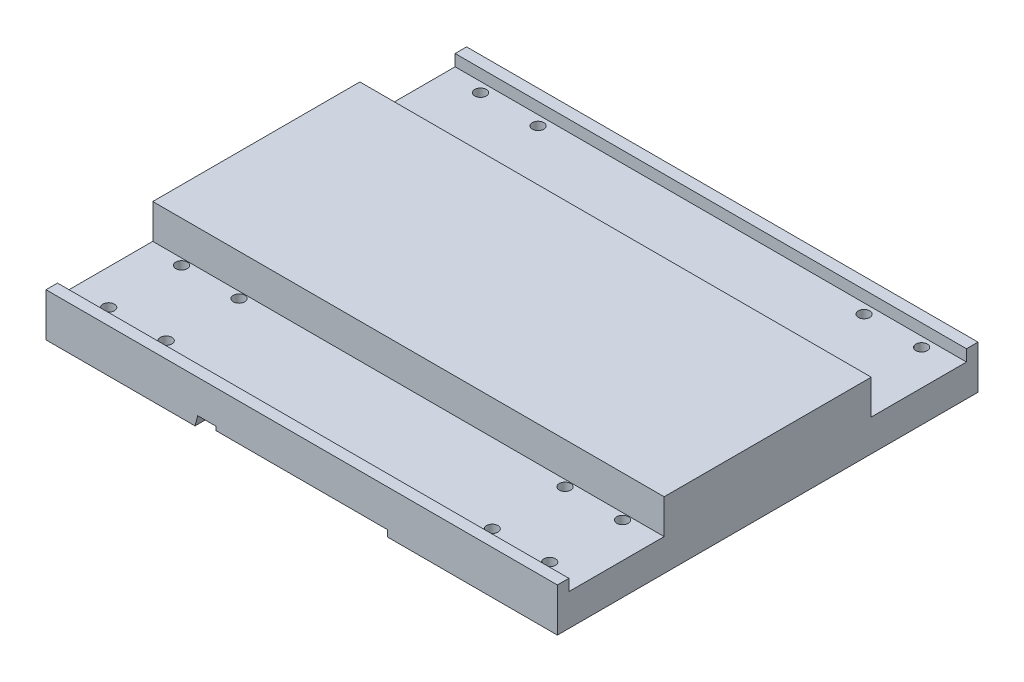
ISO-10303-21;
HEADER;
FILE_DESCRIPTION(('STEP AP214'),'2;1');
FILE_NAME('part.step','',(''),(''),'','','');
FILE_SCHEMA(('AUTOMOTIVE_DESIGN { 1 0 10303 214 1 1 1 1 }'));
ENDSEC;
DATA;
#1=APPLICATION_CONTEXT('core data for automotive mechanical design processes');
#2=APPLICATION_PROTOCOL_DEFINITION('international standard','automotive_design',2000,#1);
#3=PRODUCT_CONTEXT('',#1,'mechanical');
#4=PRODUCT('Part','Part','',(#3));
#5=PRODUCT_RELATED_PRODUCT_CATEGORY('part','',(#4));
#6=PRODUCT_DEFINITION_FORMATION('','',#4);
#7=PRODUCT_DEFINITION_CONTEXT('part definition',#1,'design');
#8=PRODUCT_DEFINITION('design','',#6,#7);
#9=PRODUCT_DEFINITION_SHAPE('','',#8);
#10=(LENGTH_UNIT() NAMED_UNIT(*) SI_UNIT(.MILLI.,.METRE.));
#11=(NAMED_UNIT(*) PLANE_ANGLE_UNIT() SI_UNIT($,.RADIAN.));
#12=(NAMED_UNIT(*) SI_UNIT($,.STERADIAN.) SOLID_ANGLE_UNIT());
#13=UNCERTAINTY_MEASURE_WITH_UNIT(LENGTH_MEASURE(1.E-05),#10,'distance_accuracy_value','');
#14=(GEOMETRIC_REPRESENTATION_CONTEXT(3) GLOBAL_UNCERTAINTY_ASSIGNED_CONTEXT((#13)) GLOBAL_UNIT_ASSIGNED_CONTEXT((#10,
#11,#12)) REPRESENTATION_CONTEXT('',''));
#15=CARTESIAN_POINT('',(0.,0.,0.));
#16=DIRECTION('',(0.,0.,1.));
#17=DIRECTION('',(1.,0.,0.));
#18=AXIS2_PLACEMENT_3D('',#15,#16,#17);
#19=CARTESIAN_POINT('',(0.,25.,0.));
#20=DIRECTION('',(0.,-1.,0.));
#21=DIRECTION('',(0.,0.,-1.));
#22=AXIS2_PLACEMENT_3D('',#19,#20,#21);
#23=PLANE('',#22);
#24=CARTESIAN_POINT('',(327.5,25.,-312.4));
#25=DIRECTION('',(0.,-1.,0.));
#26=DIRECTION('',(0.,0.,-1.));
#27=AXIS2_PLACEMENT_3D('',#24,#25,#26);
#28=CIRCLE('',#27,4.50000000000002);
#29=CARTESIAN_POINT('',(327.5,25.,-316.9));
#30=VERTEX_POINT('',#29);
#31=EDGE_CURVE('E354',#30,#30,#28,.T.);
#32=ORIENTED_EDGE('',*,*,#31,.T.);
#33=EDGE_LOOP('',(#32));
#34=FACE_BOUND('',#33,.T.);
#35=CARTESIAN_POINT('',(372.5,25.,-255.4));
#36=DIRECTION('',(0.,-1.,0.));
#37=DIRECTION('',(0.,0.,-1.));
#38=AXIS2_PLACEMENT_3D('',#35,#36,#37);
#39=CIRCLE('',#38,4.50000000000002);
#40=CARTESIAN_POINT('',(372.5,25.,-259.9));
#41=VERTEX_POINT('',#40);
#42=EDGE_CURVE('E352',#41,#41,#39,.T.);
#43=ORIENTED_EDGE('',*,*,#42,.T.);
#44=EDGE_LOOP('',(#43));
#45=FACE_BOUND('',#44,.T.);
#46=CARTESIAN_POINT('',(327.5,25.,-255.4));
#47=DIRECTION('',(0.,-1.,0.));
#48=DIRECTION('',(0.,0.,-1.));
#49=AXIS2_PLACEMENT_3D('',#46,#47,#48);
#50=CIRCLE('',#49,4.50000000000002);
#51=CARTESIAN_POINT('',(327.5,25.,-259.9));
#52=VERTEX_POINT('',#51);
#53=EDGE_CURVE('E349',#52,#52,#50,.T.);
#54=ORIENTED_EDGE('',*,*,#53,.T.);
#55=EDGE_LOOP('',(#54));
#56=FACE_BOUND('',#55,.T.);
#57=CARTESIAN_POINT('',(372.5,25.,-312.4));
#58=DIRECTION('',(0.,-1.,0.));
#59=DIRECTION('',(0.,0.,-1.));
#60=AXIS2_PLACEMENT_3D('',#57,#58,#59);
#61=CIRCLE('',#60,4.50000000000002);
#62=CARTESIAN_POINT('',(372.5,25.,-316.9));
#63=VERTEX_POINT('',#62);
#64=EDGE_CURVE('E337',#63,#63,#61,.T.);
#65=ORIENTED_EDGE('',*,*,#64,.T.);
#66=EDGE_LOOP('',(#65));
#67=FACE_BOUND('',#66,.T.);
#68=DIRECTION('',(0.,0.,1.));
#69=VECTOR('',#68,1.);
#70=CARTESIAN_POINT('',(0.,25.,0.));
#71=LINE('',#70,#69);
#72=CARTESIAN_POINT('',(0.,25.,-320.));
#73=VERTEX_POINT('',#72);
#74=CARTESIAN_POINT('',(0.,25.,-245.5));
#75=VERTEX_POINT('',#74);
#76=EDGE_CURVE('E69',#73,#75,#71,.T.);
#77=ORIENTED_EDGE('',*,*,#76,.T.);
#78=DIRECTION('',(1.,0.,0.));
#79=VECTOR('',#78,1.);
#80=CARTESIAN_POINT('',(-1.66533453693773E-13,25.,-245.5));
#81=LINE('',#80,#79);
#82=CARTESIAN_POINT('',(400.,25.,-245.5));
#83=VERTEX_POINT('',#82);
#84=EDGE_CURVE('E242',#75,#83,#81,.T.);
#85=ORIENTED_EDGE('',*,*,#84,.T.);
#86=DIRECTION('',(0.,0.,-1.));
#87=VECTOR('',#86,1.);
#88=CARTESIAN_POINT('',(400.,25.,0.));
#89=LINE('',#88,#87);
#90=CARTESIAN_POINT('',(400.,25.,-320.));
#91=VERTEX_POINT('',#90);
#92=EDGE_CURVE('E288',#83,#91,#89,.T.);
#93=ORIENTED_EDGE('',*,*,#92,.T.);
#94=DIRECTION('',(1.,0.,0.));
#95=VECTOR('',#94,1.);
#96=CARTESIAN_POINT('',(0.,25.,-320.));
#97=LINE('',#96,#95);
#98=EDGE_CURVE('E258',#73,#91,#97,.T.);
#99=ORIENTED_EDGE('',*,*,#98,.F.);
#100=EDGE_LOOP('',(#77,#85,#93,#99));
#101=FACE_BOUND('',#100,.T.);
#102=CARTESIAN_POINT('',(27.5,25.,-255.4));
#103=DIRECTION('',(0.,-1.,0.));
#104=DIRECTION('',(0.,0.,-1.));
#105=AXIS2_PLACEMENT_3D('',#102,#103,#104);
#106=CIRCLE('',#105,4.50000000000002);
#107=CARTESIAN_POINT('',(27.5,25.,-259.9));
#108=VERTEX_POINT('',#107);
#109=EDGE_CURVE('E340',#108,#108,#106,.F.);
#110=ORIENTED_EDGE('',*,*,#109,.F.);
#111=EDGE_LOOP('',(#110));
#112=FACE_BOUND('',#111,.T.);
#113=CARTESIAN_POINT('',(72.5,25.,-255.4));
#114=DIRECTION('',(0.,-1.,0.));
#115=DIRECTION('',(0.,0.,-1.));
#116=AXIS2_PLACEMENT_3D('',#113,#114,#115);
#117=CIRCLE('',#116,4.50000000000002);
#118=CARTESIAN_POINT('',(72.5,25.,-259.9));
#119=VERTEX_POINT('',#118);
#120=EDGE_CURVE('E343',#119,#119,#117,.F.);
#121=ORIENTED_EDGE('',*,*,#120,.F.);
#122=EDGE_LOOP('',(#121));
#123=FACE_BOUND('',#122,.T.);
#124=CARTESIAN_POINT('',(72.5,25.,-312.4));
#125=DIRECTION('',(0.,-1.,0.));
#126=DIRECTION('',(0.,0.,-1.));
#127=AXIS2_PLACEMENT_3D('',#124,#125,#126);
#128=CIRCLE('',#127,4.50000000000002);
#129=CARTESIAN_POINT('',(72.5,25.,-316.9));
#130=VERTEX_POINT('',#129);
#131=EDGE_CURVE('E346',#130,#130,#128,.F.);
#132=ORIENTED_EDGE('',*,*,#131,.F.);
#133=EDGE_LOOP('',(#132));
#134=FACE_BOUND('',#133,.T.);
#135=CARTESIAN_POINT('',(27.5,25.,-312.4));
#136=DIRECTION('',(0.,-1.,0.));
#137=DIRECTION('',(0.,0.,-1.));
#138=AXIS2_PLACEMENT_3D('',#135,#136,#137);
#139=CIRCLE('',#138,4.50000000000002);
#140=CARTESIAN_POINT('',(27.5,25.,-316.9));
#141=VERTEX_POINT('',#140);
#142=EDGE_CURVE('E48',#141,#141,#139,.F.);
#143=ORIENTED_EDGE('',*,*,#142,.F.);
#144=EDGE_LOOP('',(#143));
#145=FACE_BOUND('',#144,.T.);
#146=ADVANCED_FACE('F44',(#34,#45,#56,#67,#101,#112,#123,#134,#145),#23,.F.);
#147=CARTESIAN_POINT('',(327.5,25.,-21.5));
#148=DIRECTION('',(0.,-1.,0.));
#149=DIRECTION('',(0.,0.,-1.));
#150=AXIS2_PLACEMENT_3D('',#147,#148,#149);
#151=CIRCLE('',#150,4.50000000000002);
#152=CARTESIAN_POINT('',(327.5,25.,-26.));
#153=VERTEX_POINT('',#152);
#154=EDGE_CURVE('E331',#153,#153,#151,.T.);
#155=ORIENTED_EDGE('',*,*,#154,.T.);
#156=EDGE_LOOP('',(#155));
#157=FACE_BOUND('',#156,.T.);
#158=CARTESIAN_POINT('',(327.5,25.,-78.5));
#159=DIRECTION('',(0.,-1.,0.));
#160=DIRECTION('',(0.,0.,-1.));
#161=AXIS2_PLACEMENT_3D('',#158,#159,#160);
#162=CIRCLE('',#161,4.50000000000002);
#163=CARTESIAN_POINT('',(327.5,25.,-83.));
#164=VERTEX_POINT('',#163);
#165=EDGE_CURVE('E325',#164,#164,#162,.T.);
#166=ORIENTED_EDGE('',*,*,#165,.T.);
#167=EDGE_LOOP('',(#166));
#168=FACE_BOUND('',#167,.T.);
#169=CARTESIAN_POINT('',(72.5,25.,-21.5));
#170=DIRECTION('',(0.,-1.,0.));
#171=DIRECTION('',(0.,0.,-1.));
#172=AXIS2_PLACEMENT_3D('',#169,#170,#171);
#173=CIRCLE('',#172,4.50000000000002);
#174=CARTESIAN_POINT('',(72.5,25.,-26.));
#175=VERTEX_POINT('',#174);
#176=EDGE_CURVE('E322',#175,#175,#173,.F.);
#177=ORIENTED_EDGE('',*,*,#176,.F.);
#178=EDGE_LOOP('',(#177));
#179=FACE_BOUND('',#178,.T.);
#180=CARTESIAN_POINT('',(27.5,25.,-21.5));
#181=DIRECTION('',(0.,-1.,0.));
#182=DIRECTION('',(0.,0.,-1.));
#183=AXIS2_PLACEMENT_3D('',#180,#181,#182);
#184=CIRCLE('',#183,4.50000000000002);
#185=CARTESIAN_POINT('',(27.5,25.,-26.));
#186=VERTEX_POINT('',#185);
#187=EDGE_CURVE('E319',#186,#186,#184,.F.);
#188=ORIENTED_EDGE('',*,*,#187,.F.);
#189=EDGE_LOOP('',(#188));
#190=FACE_BOUND('',#189,.T.);
#191=CARTESIAN_POINT('',(27.5,25.,-78.5));
#192=DIRECTION('',(0.,-1.,0.));
#193=DIRECTION('',(0.,0.,-1.));
#194=AXIS2_PLACEMENT_3D('',#191,#192,#193);
#195=CIRCLE('',#194,4.50000000000002);
#196=CARTESIAN_POINT('',(27.5,25.,-83.));
#197=VERTEX_POINT('',#196);
#198=EDGE_CURVE('E315',#197,#197,#195,.F.);
#199=ORIENTED_EDGE('',*,*,#198,.F.);
#200=EDGE_LOOP('',(#199));
#201=FACE_BOUND('',#200,.T.);
#202=CARTESIAN_POINT('',(72.5,25.,-78.5));
#203=DIRECTION('',(0.,-1.,0.));
#204=DIRECTION('',(0.,0.,-1.));
#205=AXIS2_PLACEMENT_3D('',#202,#203,#204);
#206=CIRCLE('',#205,4.50000000000002);
#207=CARTESIAN_POINT('',(72.5,25.,-83.));
#208=VERTEX_POINT('',#207);
#209=EDGE_CURVE('E312',#208,#208,#206,.F.);
#210=ORIENTED_EDGE('',*,*,#209,.F.);
#211=EDGE_LOOP('',(#210));
#212=FACE_BOUND('',#211,.T.);
#213=CARTESIAN_POINT('',(400.,25.,-9.));
#214=VERTEX_POINT('',#213);
#215=CARTESIAN_POINT('',(400.,25.,-83.5));
#216=VERTEX_POINT('',#215);
#217=EDGE_CURVE('E290',#214,#216,#89,.T.);
#218=ORIENTED_EDGE('',*,*,#217,.T.);
#219=DIRECTION('',(1.,0.,0.));
#220=VECTOR('',#219,1.);
#221=CARTESIAN_POINT('',(-1.66533453693773E-13,25.,-83.5));
#222=LINE('',#221,#220);
#223=CARTESIAN_POINT('',(0.,25.,-83.5));
#224=VERTEX_POINT('',#223);
#225=EDGE_CURVE('E61',#224,#216,#222,.T.);
#226=ORIENTED_EDGE('',*,*,#225,.F.);
#227=CARTESIAN_POINT('',(0.,25.,-9.));
#228=VERTEX_POINT('',#227);
#229=EDGE_CURVE('E289',#224,#228,#71,.T.);
#230=ORIENTED_EDGE('',*,*,#229,.T.);
#231=DIRECTION('',(-1.,0.,0.));
#232=VECTOR('',#231,1.);
#233=CARTESIAN_POINT('',(0.,25.,-9.));
#234=LINE('',#233,#232);
#235=EDGE_CURVE('E255',#214,#228,#234,.T.);
#236=ORIENTED_EDGE('',*,*,#235,.F.);
#237=EDGE_LOOP('',(#218,#226,#230,#236));
#238=FACE_BOUND('',#237,.T.);
#239=CARTESIAN_POINT('',(372.5,25.,-21.5));
#240=DIRECTION('',(0.,-1.,0.));
#241=DIRECTION('',(0.,0.,-1.));
#242=AXIS2_PLACEMENT_3D('',#239,#240,#241);
#243=CIRCLE('',#242,4.50000000000002);
#244=CARTESIAN_POINT('',(372.5,25.,-26.));
#245=VERTEX_POINT('',#244);
#246=EDGE_CURVE('E328',#245,#245,#243,.T.);
#247=ORIENTED_EDGE('',*,*,#246,.T.);
#248=EDGE_LOOP('',(#247));
#249=FACE_BOUND('',#248,.T.);
#250=CARTESIAN_POINT('',(372.5,25.,-78.5));
#251=DIRECTION('',(0.,-1.,0.));
#252=DIRECTION('',(0.,0.,-1.));
#253=AXIS2_PLACEMENT_3D('',#250,#251,#252);
#254=CIRCLE('',#253,4.50000000000002);
#255=CARTESIAN_POINT('',(372.5,25.,-83.));
#256=VERTEX_POINT('',#255);
#257=EDGE_CURVE('E334',#256,#256,#254,.T.);
#258=ORIENTED_EDGE('',*,*,#257,.T.);
#259=EDGE_LOOP('',(#258));
#260=FACE_BOUND('',#259,.T.);
#261=ADVANCED_FACE('F364',(#157,#168,#179,#190,#201,#212,#238,#249,#260),#23,.F.);
#262=CARTESIAN_POINT('',(0.,0.,0.));
#263=DIRECTION('',(0.,-1.,0.));
#264=DIRECTION('',(0.,0.,-1.));
#265=AXIS2_PLACEMENT_3D('',#262,#263,#264);
#266=PLANE('',#265);
#267=CARTESIAN_POINT('',(27.5,0.,-312.4));
#268=DIRECTION('',(0.,1.,0.));
#269=DIRECTION('',(0.,0.,1.));
#270=AXIS2_PLACEMENT_3D('',#267,#268,#269);
#271=CIRCLE('',#270,4.50000000000002);
#272=CARTESIAN_POINT('',(27.5,0.,-307.9));
#273=VERTEX_POINT('',#272);
#274=EDGE_CURVE('E397',#273,#273,#271,.T.);
#275=ORIENTED_EDGE('',*,*,#274,.T.);
#276=EDGE_LOOP('',(#275));
#277=FACE_BOUND('',#276,.T.);
#278=CARTESIAN_POINT('',(72.5,0.,-21.5));
#279=DIRECTION('',(0.,1.,0.));
#280=DIRECTION('',(0.,0.,1.));
#281=AXIS2_PLACEMENT_3D('',#278,#279,#280);
#282=CIRCLE('',#281,4.50000000000002);
#283=CARTESIAN_POINT('',(72.5,0.,-17.));
#284=VERTEX_POINT('',#283);
#285=EDGE_CURVE('E401',#284,#284,#282,.T.);
#286=ORIENTED_EDGE('',*,*,#285,.T.);
#287=EDGE_LOOP('',(#286));
#288=FACE_BOUND('',#287,.T.);
#289=CARTESIAN_POINT('',(27.5,0.,-21.5));
#290=DIRECTION('',(0.,1.,0.));
#291=DIRECTION('',(0.,0.,1.));
#292=AXIS2_PLACEMENT_3D('',#289,#290,#291);
#293=CIRCLE('',#292,4.50000000000002);
#294=CARTESIAN_POINT('',(27.5,0.,-17.));
#295=VERTEX_POINT('',#294);
#296=EDGE_CURVE('E405',#295,#295,#293,.T.);
#297=ORIENTED_EDGE('',*,*,#296,.T.);
#298=EDGE_LOOP('',(#297));
#299=FACE_BOUND('',#298,.T.);
#300=CARTESIAN_POINT('',(27.5,0.,-78.5));
#301=DIRECTION('',(0.,1.,0.));
#302=DIRECTION('',(0.,0.,1.));
#303=AXIS2_PLACEMENT_3D('',#300,#301,#302);
#304=CIRCLE('',#303,4.50000000000002);
#305=CARTESIAN_POINT('',(27.5,0.,-74.));
#306=VERTEX_POINT('',#305);
#307=EDGE_CURVE('E409',#306,#306,#304,.T.);
#308=ORIENTED_EDGE('',*,*,#307,.T.);
#309=EDGE_LOOP('',(#308));
#310=FACE_BOUND('',#309,.T.);
#311=CARTESIAN_POINT('',(72.5,0.,-312.4));
#312=DIRECTION('',(0.,1.,0.));
#313=DIRECTION('',(0.,0.,1.));
#314=AXIS2_PLACEMENT_3D('',#311,#312,#313);
#315=CIRCLE('',#314,4.50000000000002);
#316=CARTESIAN_POINT('',(72.5,0.,-307.9));
#317=VERTEX_POINT('',#316);
#318=EDGE_CURVE('E413',#317,#317,#315,.T.);
#319=ORIENTED_EDGE('',*,*,#318,.T.);
#320=EDGE_LOOP('',(#319));
#321=FACE_BOUND('',#320,.T.);
#322=CARTESIAN_POINT('',(72.5,0.,-255.4));
#323=DIRECTION('',(0.,1.,0.));
#324=DIRECTION('',(0.,0.,1.));
#325=AXIS2_PLACEMENT_3D('',#322,#323,#324);
#326=CIRCLE('',#325,4.50000000000002);
#327=CARTESIAN_POINT('',(72.5,0.,-250.9));
#328=VERTEX_POINT('',#327);
#329=EDGE_CURVE('E417',#328,#328,#326,.T.);
#330=ORIENTED_EDGE('',*,*,#329,.T.);
#331=EDGE_LOOP('',(#330));
#332=FACE_BOUND('',#331,.T.);
#333=CARTESIAN_POINT('',(27.5,0.,-255.4));
#334=DIRECTION('',(0.,1.,0.));
#335=DIRECTION('',(0.,0.,1.));
#336=AXIS2_PLACEMENT_3D('',#333,#334,#335);
#337=CIRCLE('',#336,4.50000000000002);
#338=CARTESIAN_POINT('',(27.5,0.,-250.9));
#339=VERTEX_POINT('',#338);
#340=EDGE_CURVE('E421',#339,#339,#337,.T.);
#341=ORIENTED_EDGE('',*,*,#340,.T.);
#342=EDGE_LOOP('',(#341));
#343=FACE_BOUND('',#342,.T.);
#344=CARTESIAN_POINT('',(72.5,0.,-78.5));
#345=DIRECTION('',(0.,1.,0.));
#346=DIRECTION('',(0.,0.,1.));
#347=AXIS2_PLACEMENT_3D('',#344,#345,#346);
#348=CIRCLE('',#347,4.50000000000002);
#349=CARTESIAN_POINT('',(72.5,0.,-74.));
#350=VERTEX_POINT('',#349);
#351=EDGE_CURVE('E425',#350,#350,#348,.T.);
#352=ORIENTED_EDGE('',*,*,#351,.T.);
#353=EDGE_LOOP('',(#352));
#354=FACE_BOUND('',#353,.T.);
#355=DIRECTION('',(0.,0.,1.));
#356=VECTOR('',#355,1.);
#357=CARTESIAN_POINT('',(116.556406460551,0.,-400.));
#358=LINE('',#357,#356);
#359=CARTESIAN_POINT('',(116.556406460551,0.,-329.));
#360=VERTEX_POINT('',#359);
#361=CARTESIAN_POINT('',(116.556406460551,0.,0.));
#362=VERTEX_POINT('',#361);
#363=EDGE_CURVE('E191',#360,#362,#358,.T.);
#364=ORIENTED_EDGE('',*,*,#363,.T.);
#365=DIRECTION('',(1.,0.,0.));
#366=VECTOR('',#365,1.);
#367=CARTESIAN_POINT('',(0.,0.,0.));
#368=LINE('',#367,#366);
#369=CARTESIAN_POINT('',(0.,0.,0.));
#370=VERTEX_POINT('',#369);
#371=EDGE_CURVE('E190',#370,#362,#368,.T.);
#372=ORIENTED_EDGE('',*,*,#371,.F.);
#373=DIRECTION('',(0.,0.,1.));
#374=VECTOR('',#373,1.);
#375=CARTESIAN_POINT('',(0.,0.,0.));
#376=LINE('',#375,#374);
#377=CARTESIAN_POINT('',(0.,0.,-329.));
#378=VERTEX_POINT('',#377);
#379=EDGE_CURVE('E286',#378,#370,#376,.T.);
#380=ORIENTED_EDGE('',*,*,#379,.F.);
#381=DIRECTION('',(-1.,0.,0.));
#382=VECTOR('',#381,1.);
#383=CARTESIAN_POINT('',(0.,0.,-329.));
#384=LINE('',#383,#382);
#385=EDGE_CURVE('E299',#360,#378,#384,.T.);
#386=ORIENTED_EDGE('',*,*,#385,.F.);
#387=EDGE_LOOP('',(#364,#372,#380,#386));
#388=FACE_BOUND('',#387,.T.);
#389=ADVANCED_FACE('F369',(#277,#288,#299,#310,#321,#332,#343,#354,#388),#266,.T.);
#390=CARTESIAN_POINT('',(0.,25.,0.));
#391=DIRECTION('',(0.,0.,-1.));
#392=DIRECTION('',(-1.,0.,0.));
#393=AXIS2_PLACEMENT_3D('',#390,#391,#392);
#394=PLANE('',#393);
#395=ORIENTED_EDGE('',*,*,#371,.T.);
#396=DIRECTION('',(-0.258819045102524,-0.965925826289068,0.));
#397=VECTOR('',#396,1.);
#398=CARTESIAN_POINT('',(118.7,8.,0.));
#399=LINE('',#398,#397);
#400=CARTESIAN_POINT('',(118.7,8.,0.));
#401=VERTEX_POINT('',#400);
#402=EDGE_CURVE('E173',#401,#362,#399,.T.);
#403=ORIENTED_EDGE('',*,*,#402,.F.);
#404=DIRECTION('',(1.,0.,0.));
#405=VECTOR('',#404,1.);
#406=CARTESIAN_POINT('',(0.,7.99999999999995,0.));
#407=LINE('',#406,#405);
#408=CARTESIAN_POINT('',(133.,8.,0.));
#409=VERTEX_POINT('',#408);
#410=EDGE_CURVE('E188',#401,#409,#407,.T.);
#411=ORIENTED_EDGE('',*,*,#410,.T.);
#412=DIRECTION('',(0.,1.,0.));
#413=VECTOR('',#412,1.);
#414=CARTESIAN_POINT('',(133.,0.,0.));
#415=LINE('',#414,#413);
#416=CARTESIAN_POINT('',(133.,5.,0.));
#417=VERTEX_POINT('',#416);
#418=EDGE_CURVE('E181',#417,#409,#415,.T.);
#419=ORIENTED_EDGE('',*,*,#418,.F.);
#420=DIRECTION('',(-1.,0.,0.));
#421=VECTOR('',#420,1.);
#422=CARTESIAN_POINT('',(0.,5.,0.));
#423=LINE('',#422,#421);
#424=CARTESIAN_POINT('',(267.25,5.,0.));
#425=VERTEX_POINT('',#424);
#426=EDGE_CURVE('E208',#425,#417,#423,.T.);
#427=ORIENTED_EDGE('',*,*,#426,.F.);
#428=DIRECTION('',(0.,-1.,0.));
#429=VECTOR('',#428,1.);
#430=CARTESIAN_POINT('',(267.25,5.,0.));
#431=LINE('',#430,#429);
#432=CARTESIAN_POINT('',(267.25,0.,0.));
#433=VERTEX_POINT('',#432);
#434=EDGE_CURVE('E216',#425,#433,#431,.T.);
#435=ORIENTED_EDGE('',*,*,#434,.T.);
#436=CARTESIAN_POINT('',(400.,0.,0.));
#437=VERTEX_POINT('',#436);
#438=EDGE_CURVE('E295',#433,#437,#368,.T.);
#439=ORIENTED_EDGE('',*,*,#438,.T.);
#440=DIRECTION('',(0.,-1.,0.));
#441=VECTOR('',#440,1.);
#442=CARTESIAN_POINT('',(400.,25.,0.));
#443=LINE('',#442,#441);
#444=CARTESIAN_POINT('',(400.,34.,0.));
#445=VERTEX_POINT('',#444);
#446=EDGE_CURVE('E308',#445,#437,#443,.T.);
#447=ORIENTED_EDGE('',*,*,#446,.F.);
#448=DIRECTION('',(1.,0.,0.));
#449=VECTOR('',#448,1.);
#450=CARTESIAN_POINT('',(400.,34.,0.));
#451=LINE('',#450,#449);
#452=CARTESIAN_POINT('',(0.,34.,0.));
#453=VERTEX_POINT('',#452);
#454=EDGE_CURVE('E259',#453,#445,#451,.T.);
#455=ORIENTED_EDGE('',*,*,#454,.F.);
#456=DIRECTION('',(0.,-1.,0.));
#457=VECTOR('',#456,1.);
#458=CARTESIAN_POINT('',(0.,25.,0.));
#459=LINE('',#458,#457);
#460=EDGE_CURVE('E53',#453,#370,#459,.T.);
#461=ORIENTED_EDGE('',*,*,#460,.T.);
#462=EDGE_LOOP('',(#395,#403,#411,#419,#427,#435,#439,#447,#455,#461));
#463=FACE_BOUND('',#462,.T.);
#464=ADVANCED_FACE('F186',(#463),#394,.F.);
#465=CARTESIAN_POINT('',(0.,25.,-329.));
#466=DIRECTION('',(0.,0.,1.));
#467=DIRECTION('',(1.,0.,0.));
#468=AXIS2_PLACEMENT_3D('',#465,#466,#467);
#469=PLANE('',#468);
#470=DIRECTION('',(1.,0.,0.));
#471=VECTOR('',#470,1.);
#472=CARTESIAN_POINT('',(0.,7.99999999999995,-329.));
#473=LINE('',#472,#471);
#474=CARTESIAN_POINT('',(118.7,8.,-329.));
#475=VERTEX_POINT('',#474);
#476=CARTESIAN_POINT('',(133.,8.,-329.));
#477=VERTEX_POINT('',#476);
#478=EDGE_CURVE('E12',#475,#477,#473,.T.);
#479=ORIENTED_EDGE('',*,*,#478,.F.);
#480=DIRECTION('',(-0.258819045102524,-0.965925826289067,0.));
#481=VECTOR('',#480,1.);
#482=CARTESIAN_POINT('',(114.998607714606,-5.81378406783267,-329.));
#483=LINE('',#482,#481);
#484=EDGE_CURVE('E176',#475,#360,#483,.T.);
#485=ORIENTED_EDGE('',*,*,#484,.T.);
#486=ORIENTED_EDGE('',*,*,#385,.T.);
#487=DIRECTION('',(0.,-1.,0.));
#488=VECTOR('',#487,1.);
#489=CARTESIAN_POINT('',(0.,25.,-329.));
#490=LINE('',#489,#488);
#491=CARTESIAN_POINT('',(0.,34.,-329.));
#492=VERTEX_POINT('',#491);
#493=EDGE_CURVE('E292',#492,#378,#490,.T.);
#494=ORIENTED_EDGE('',*,*,#493,.F.);
#495=DIRECTION('',(-1.,0.,0.));
#496=VECTOR('',#495,1.);
#497=CARTESIAN_POINT('',(400.,34.,-329.));
#498=LINE('',#497,#496);
#499=CARTESIAN_POINT('',(400.,34.,-329.));
#500=VERTEX_POINT('',#499);
#501=EDGE_CURVE('E268',#500,#492,#498,.T.);
#502=ORIENTED_EDGE('',*,*,#501,.F.);
#503=DIRECTION('',(0.,-1.,0.));
#504=VECTOR('',#503,1.);
#505=CARTESIAN_POINT('',(400.,25.,-329.));
#506=LINE('',#505,#504);
#507=CARTESIAN_POINT('',(400.,0.,-329.));
#508=VERTEX_POINT('',#507);
#509=EDGE_CURVE('E305',#500,#508,#506,.T.);
#510=ORIENTED_EDGE('',*,*,#509,.T.);
#511=CARTESIAN_POINT('',(267.25,0.,-329.));
#512=VERTEX_POINT('',#511);
#513=EDGE_CURVE('E300',#508,#512,#384,.T.);
#514=ORIENTED_EDGE('',*,*,#513,.T.);
#515=DIRECTION('',(0.,-1.,0.));
#516=VECTOR('',#515,1.);
#517=CARTESIAN_POINT('',(267.25,5.,-329.));
#518=LINE('',#517,#516);
#519=CARTESIAN_POINT('',(267.25,5.,-329.));
#520=VERTEX_POINT('',#519);
#521=EDGE_CURVE('E219',#520,#512,#518,.T.);
#522=ORIENTED_EDGE('',*,*,#521,.F.);
#523=DIRECTION('',(1.,0.,0.));
#524=VECTOR('',#523,1.);
#525=CARTESIAN_POINT('',(0.,5.,-329.));
#526=LINE('',#525,#524);
#527=CARTESIAN_POINT('',(133.,5.,-329.));
#528=VERTEX_POINT('',#527);
#529=EDGE_CURVE('E213',#528,#520,#526,.T.);
#530=ORIENTED_EDGE('',*,*,#529,.F.);
#531=DIRECTION('',(0.,1.,0.));
#532=VECTOR('',#531,1.);
#533=CARTESIAN_POINT('',(133.,25.,-329.));
#534=LINE('',#533,#532);
#535=EDGE_CURVE('E201',#528,#477,#534,.T.);
#536=ORIENTED_EDGE('',*,*,#535,.T.);
#537=EDGE_LOOP('',(#479,#485,#486,#494,#502,#510,#514,#522,#530,#536));
#538=FACE_BOUND('',#537,.T.);
#539=ADVANCED_FACE('F379',(#538),#469,.F.);
#540=CARTESIAN_POINT('',(372.5,0.,-78.5));
#541=DIRECTION('',(0.,-1.,0.));
#542=DIRECTION('',(0.,0.,-1.));
#543=AXIS2_PLACEMENT_3D('',#540,#541,#542);
#544=CIRCLE('',#543,4.50000000000002);
#545=CARTESIAN_POINT('',(372.5,0.,-83.));
#546=VERTEX_POINT('',#545);
#547=EDGE_CURVE('E441',#546,#546,#544,.T.);
#548=ORIENTED_EDGE('',*,*,#547,.F.);
#549=EDGE_LOOP('',(#548));
#550=FACE_BOUND('',#549,.T.);
#551=CARTESIAN_POINT('',(327.5,0.,-21.5));
#552=DIRECTION('',(0.,-1.,0.));
#553=DIRECTION('',(0.,0.,-1.));
#554=AXIS2_PLACEMENT_3D('',#551,#552,#553);
#555=CIRCLE('',#554,4.50000000000002);
#556=CARTESIAN_POINT('',(327.5,0.,-26.));
#557=VERTEX_POINT('',#556);
#558=EDGE_CURVE('E444',#557,#557,#555,.T.);
#559=ORIENTED_EDGE('',*,*,#558,.F.);
#560=EDGE_LOOP('',(#559));
#561=FACE_BOUND('',#560,.T.);
#562=CARTESIAN_POINT('',(372.5,0.,-21.5));
#563=DIRECTION('',(0.,-1.,0.));
#564=DIRECTION('',(0.,0.,-1.));
#565=AXIS2_PLACEMENT_3D('',#562,#563,#564);
#566=CIRCLE('',#565,4.50000000000002);
#567=CARTESIAN_POINT('',(372.5,0.,-26.));
#568=VERTEX_POINT('',#567);
#569=EDGE_CURVE('E447',#568,#568,#566,.T.);
#570=ORIENTED_EDGE('',*,*,#569,.F.);
#571=EDGE_LOOP('',(#570));
#572=FACE_BOUND('',#571,.T.);
#573=CARTESIAN_POINT('',(327.5,0.,-312.4));
#574=DIRECTION('',(0.,-1.,0.));
#575=DIRECTION('',(0.,0.,-1.));
#576=AXIS2_PLACEMENT_3D('',#573,#574,#575);
#577=CIRCLE('',#576,4.50000000000002);
#578=CARTESIAN_POINT('',(327.5,0.,-316.9));
#579=VERTEX_POINT('',#578);
#580=EDGE_CURVE('E431',#579,#579,#577,.T.);
#581=ORIENTED_EDGE('',*,*,#580,.F.);
#582=EDGE_LOOP('',(#581));
#583=FACE_BOUND('',#582,.T.);
#584=CARTESIAN_POINT('',(372.5,0.,-255.4));
#585=DIRECTION('',(0.,-1.,0.));
#586=DIRECTION('',(0.,0.,-1.));
#587=AXIS2_PLACEMENT_3D('',#584,#585,#586);
#588=CIRCLE('',#587,4.50000000000002);
#589=CARTESIAN_POINT('',(372.5,0.,-259.9));
#590=VERTEX_POINT('',#589);
#591=EDGE_CURVE('E432',#590,#590,#588,.T.);
#592=ORIENTED_EDGE('',*,*,#591,.F.);
#593=EDGE_LOOP('',(#592));
#594=FACE_BOUND('',#593,.T.);
#595=CARTESIAN_POINT('',(327.5,0.,-255.4));
#596=DIRECTION('',(0.,-1.,0.));
#597=DIRECTION('',(0.,0.,-1.));
#598=AXIS2_PLACEMENT_3D('',#595,#596,#597);
#599=CIRCLE('',#598,4.50000000000002);
#600=CARTESIAN_POINT('',(327.5,0.,-259.9));
#601=VERTEX_POINT('',#600);
#602=EDGE_CURVE('E435',#601,#601,#599,.T.);
#603=ORIENTED_EDGE('',*,*,#602,.F.);
#604=EDGE_LOOP('',(#603));
#605=FACE_BOUND('',#604,.T.);
#606=CARTESIAN_POINT('',(327.5,0.,-78.5));
#607=DIRECTION('',(0.,-1.,0.));
#608=DIRECTION('',(0.,0.,-1.));
#609=AXIS2_PLACEMENT_3D('',#606,#607,#608);
#610=CIRCLE('',#609,4.50000000000002);
#611=CARTESIAN_POINT('',(327.5,0.,-83.));
#612=VERTEX_POINT('',#611);
#613=EDGE_CURVE('E438',#612,#612,#610,.T.);
#614=ORIENTED_EDGE('',*,*,#613,.F.);
#615=EDGE_LOOP('',(#614));
#616=FACE_BOUND('',#615,.T.);
#617=CARTESIAN_POINT('',(372.5,0.,-312.4));
#618=DIRECTION('',(0.,-1.,0.));
#619=DIRECTION('',(0.,0.,-1.));
#620=AXIS2_PLACEMENT_3D('',#617,#618,#619);
#621=CIRCLE('',#620,4.50000000000002);
#622=CARTESIAN_POINT('',(372.5,0.,-316.9));
#623=VERTEX_POINT('',#622);
#624=EDGE_CURVE('E316',#623,#623,#621,.T.);
#625=ORIENTED_EDGE('',*,*,#624,.F.);
#626=EDGE_LOOP('',(#625));
#627=FACE_BOUND('',#626,.T.);
#628=ORIENTED_EDGE('',*,*,#438,.F.);
#629=DIRECTION('',(0.,0.,-1.));
#630=VECTOR('',#629,1.);
#631=CARTESIAN_POINT('',(267.25,0.,0.));
#632=LINE('',#631,#630);
#633=EDGE_CURVE('E205',#433,#512,#632,.T.);
#634=ORIENTED_EDGE('',*,*,#633,.T.);
#635=ORIENTED_EDGE('',*,*,#513,.F.);
#636=DIRECTION('',(0.,0.,-1.));
#637=VECTOR('',#636,1.);
#638=CARTESIAN_POINT('',(400.,0.,0.));
#639=LINE('',#638,#637);
#640=EDGE_CURVE('E297',#437,#508,#639,.T.);
#641=ORIENTED_EDGE('',*,*,#640,.F.);
#642=EDGE_LOOP('',(#628,#634,#635,#641));
#643=FACE_BOUND('',#642,.T.);
#644=ADVANCED_FACE('F376',(#550,#561,#572,#583,#594,#605,#616,#627,#643),#266,.T.);
#645=CARTESIAN_POINT('',(0.,25.,0.));
#646=DIRECTION('',(1.,0.,0.));
#647=DIRECTION('',(0.,0.,-1.));
#648=AXIS2_PLACEMENT_3D('',#645,#646,#647);
#649=PLANE('',#648);
#650=ORIENTED_EDGE('',*,*,#379,.T.);
#651=ORIENTED_EDGE('',*,*,#460,.F.);
#652=DIRECTION('',(0.,0.,1.));
#653=VECTOR('',#652,1.);
#654=CARTESIAN_POINT('',(0.,34.,0.));
#655=LINE('',#654,#653);
#656=CARTESIAN_POINT('',(0.,34.,-9.));
#657=VERTEX_POINT('',#656);
#658=EDGE_CURVE('E254',#657,#453,#655,.T.);
#659=ORIENTED_EDGE('',*,*,#658,.F.);
#660=DIRECTION('',(0.,-1.,0.));
#661=VECTOR('',#660,1.);
#662=CARTESIAN_POINT('',(0.,34.,-9.));
#663=LINE('',#662,#661);
#664=EDGE_CURVE('E251',#657,#228,#663,.T.);
#665=ORIENTED_EDGE('',*,*,#664,.T.);
#666=ORIENTED_EDGE('',*,*,#229,.F.);
#667=DIRECTION('',(0.,-1.,0.));
#668=VECTOR('',#667,1.);
#669=CARTESIAN_POINT('',(-1.66533453693773E-13,0.,-83.5));
#670=LINE('',#669,#668);
#671=CARTESIAN_POINT('',(-1.66533453693773E-13,52.,-83.5));
#672=VERTEX_POINT('',#671);
#673=EDGE_CURVE('E231',#672,#224,#670,.T.);
#674=ORIENTED_EDGE('',*,*,#673,.F.);
#675=DIRECTION('',(0.,0.,1.));
#676=VECTOR('',#675,1.);
#677=CARTESIAN_POINT('',(-1.66533453693773E-13,52.,0.));
#678=LINE('',#677,#676);
#679=CARTESIAN_POINT('',(-1.66533453693773E-13,52.,-245.5));
#680=VERTEX_POINT('',#679);
#681=EDGE_CURVE('E227',#680,#672,#678,.T.);
#682=ORIENTED_EDGE('',*,*,#681,.F.);
#683=DIRECTION('',(0.,1.,0.));
#684=VECTOR('',#683,1.);
#685=CARTESIAN_POINT('',(-1.66533453693773E-13,0.,-245.5));
#686=LINE('',#685,#684);
#687=EDGE_CURVE('E224',#75,#680,#686,.T.);
#688=ORIENTED_EDGE('',*,*,#687,.F.);
#689=ORIENTED_EDGE('',*,*,#76,.F.);
#690=DIRECTION('',(0.,-1.,0.));
#691=VECTOR('',#690,1.);
#692=CARTESIAN_POINT('',(0.,34.,-320.));
#693=LINE('',#692,#691);
#694=CARTESIAN_POINT('',(0.,34.,-320.));
#695=VERTEX_POINT('',#694);
#696=EDGE_CURVE('E283',#695,#73,#693,.T.);
#697=ORIENTED_EDGE('',*,*,#696,.F.);
#698=DIRECTION('',(0.,0.,1.));
#699=VECTOR('',#698,1.);
#700=CARTESIAN_POINT('',(0.,34.,-329.));
#701=LINE('',#700,#699);
#702=EDGE_CURVE('E271',#492,#695,#701,.T.);
#703=ORIENTED_EDGE('',*,*,#702,.F.);
#704=ORIENTED_EDGE('',*,*,#493,.T.);
#705=EDGE_LOOP('',(#650,#651,#659,#665,#666,#674,#682,#688,#689,#697,#703,#704));
#706=FACE_BOUND('',#705,.T.);
#707=ADVANCED_FACE('F46',(#706),#649,.F.);
#708=CARTESIAN_POINT('',(400.,25.,0.));
#709=DIRECTION('',(-1.,0.,0.));
#710=DIRECTION('',(0.,0.,1.));
#711=AXIS2_PLACEMENT_3D('',#708,#709,#710);
#712=PLANE('',#711);
#713=ORIENTED_EDGE('',*,*,#640,.T.);
#714=ORIENTED_EDGE('',*,*,#509,.F.);
#715=DIRECTION('',(0.,0.,-1.));
#716=VECTOR('',#715,1.);
#717=CARTESIAN_POINT('',(400.,34.,-320.));
#718=LINE('',#717,#716);
#719=CARTESIAN_POINT('',(400.,34.,-320.));
#720=VERTEX_POINT('',#719);
#721=EDGE_CURVE('E275',#720,#500,#718,.T.);
#722=ORIENTED_EDGE('',*,*,#721,.F.);
#723=DIRECTION('',(0.,-1.,0.));
#724=VECTOR('',#723,1.);
#725=CARTESIAN_POINT('',(400.,34.,-320.));
#726=LINE('',#725,#724);
#727=EDGE_CURVE('E278',#720,#91,#726,.T.);
#728=ORIENTED_EDGE('',*,*,#727,.T.);
#729=ORIENTED_EDGE('',*,*,#92,.F.);
#730=DIRECTION('',(0.,1.,0.));
#731=VECTOR('',#730,1.);
#732=CARTESIAN_POINT('',(400.,0.,-245.5));
#733=LINE('',#732,#731);
#734=CARTESIAN_POINT('',(400.,52.,-245.5));
#735=VERTEX_POINT('',#734);
#736=EDGE_CURVE('E221',#83,#735,#733,.T.);
#737=ORIENTED_EDGE('',*,*,#736,.T.);
#738=DIRECTION('',(0.,0.,1.));
#739=VECTOR('',#738,1.);
#740=CARTESIAN_POINT('',(400.,52.,0.));
#741=LINE('',#740,#739);
#742=CARTESIAN_POINT('',(400.,52.,-83.5));
#743=VERTEX_POINT('',#742);
#744=EDGE_CURVE('E237',#735,#743,#741,.T.);
#745=ORIENTED_EDGE('',*,*,#744,.T.);
#746=DIRECTION('',(0.,-1.,0.));
#747=VECTOR('',#746,1.);
#748=CARTESIAN_POINT('',(400.,0.,-83.5));
#749=LINE('',#748,#747);
#750=EDGE_CURVE('E228',#743,#216,#749,.T.);
#751=ORIENTED_EDGE('',*,*,#750,.T.);
#752=ORIENTED_EDGE('',*,*,#217,.F.);
#753=DIRECTION('',(0.,-1.,0.));
#754=VECTOR('',#753,1.);
#755=CARTESIAN_POINT('',(400.,34.,-9.));
#756=LINE('',#755,#754);
#757=CARTESIAN_POINT('',(400.,34.,-9.));
#758=VERTEX_POINT('',#757);
#759=EDGE_CURVE('E244',#758,#214,#756,.T.);
#760=ORIENTED_EDGE('',*,*,#759,.F.);
#761=DIRECTION('',(0.,0.,-1.));
#762=VECTOR('',#761,1.);
#763=CARTESIAN_POINT('',(400.,34.,-9.));
#764=LINE('',#763,#762);
#765=EDGE_CURVE('E264',#445,#758,#764,.T.);
#766=ORIENTED_EDGE('',*,*,#765,.F.);
#767=ORIENTED_EDGE('',*,*,#446,.T.);
#768=EDGE_LOOP('',(#713,#714,#722,#728,#729,#737,#745,#751,#752,#760,#766,#767));
#769=FACE_BOUND('',#768,.T.);
#770=ADVANCED_FACE('F384',(#769),#712,.F.);
#771=CARTESIAN_POINT('',(0.,34.,-320.));
#772=DIRECTION('',(0.,0.,-1.));
#773=DIRECTION('',(-1.,0.,0.));
#774=AXIS2_PLACEMENT_3D('',#771,#772,#773);
#775=PLANE('',#774);
#776=ORIENTED_EDGE('',*,*,#98,.T.);
#777=ORIENTED_EDGE('',*,*,#727,.F.);
#778=DIRECTION('',(1.,0.,0.));
#779=VECTOR('',#778,1.);
#780=CARTESIAN_POINT('',(0.,34.,-320.));
#781=LINE('',#780,#779);
#782=EDGE_CURVE('E273',#695,#720,#781,.T.);
#783=ORIENTED_EDGE('',*,*,#782,.F.);
#784=ORIENTED_EDGE('',*,*,#696,.T.);
#785=EDGE_LOOP('',(#776,#777,#783,#784));
#786=FACE_BOUND('',#785,.T.);
#787=ADVANCED_FACE('F374',(#786),#775,.F.);
#788=CARTESIAN_POINT('',(0.,34.,0.));
#789=DIRECTION('',(0.,1.,0.));
#790=DIRECTION('',(0.,0.,1.));
#791=AXIS2_PLACEMENT_3D('',#788,#789,#790);
#792=PLANE('',#791);
#793=ORIENTED_EDGE('',*,*,#501,.T.);
#794=ORIENTED_EDGE('',*,*,#702,.T.);
#795=ORIENTED_EDGE('',*,*,#782,.T.);
#796=ORIENTED_EDGE('',*,*,#721,.T.);
#797=EDGE_LOOP('',(#793,#794,#795,#796));
#798=FACE_BOUND('',#797,.T.);
#799=ADVANCED_FACE('F502',(#798),#792,.T.);
#800=CARTESIAN_POINT('',(0.,34.,-9.));
#801=DIRECTION('',(0.,0.,1.));
#802=DIRECTION('',(1.,0.,0.));
#803=AXIS2_PLACEMENT_3D('',#800,#801,#802);
#804=PLANE('',#803);
#805=ORIENTED_EDGE('',*,*,#235,.T.);
#806=ORIENTED_EDGE('',*,*,#664,.F.);
#807=DIRECTION('',(-1.,0.,0.));
#808=VECTOR('',#807,1.);
#809=CARTESIAN_POINT('',(0.,34.,-9.));
#810=LINE('',#809,#808);
#811=EDGE_CURVE('E262',#758,#657,#810,.T.);
#812=ORIENTED_EDGE('',*,*,#811,.F.);
#813=ORIENTED_EDGE('',*,*,#759,.T.);
#814=EDGE_LOOP('',(#805,#806,#812,#813));
#815=FACE_BOUND('',#814,.T.);
#816=ADVANCED_FACE('F523',(#815),#804,.F.);
#817=CARTESIAN_POINT('',(0.,34.,0.));
#818=DIRECTION('',(0.,-1.,0.));
#819=DIRECTION('',(0.,0.,-1.));
#820=AXIS2_PLACEMENT_3D('',#817,#818,#819);
#821=PLANE('',#820);
#822=ORIENTED_EDGE('',*,*,#454,.T.);
#823=ORIENTED_EDGE('',*,*,#765,.T.);
#824=ORIENTED_EDGE('',*,*,#811,.T.);
#825=ORIENTED_EDGE('',*,*,#658,.T.);
#826=EDGE_LOOP('',(#822,#823,#824,#825));
#827=FACE_BOUND('',#826,.T.);
#828=ADVANCED_FACE('F484',(#827),#821,.F.);
#829=CARTESIAN_POINT('',(-1.66533453693773E-13,0.,-245.5));
#830=DIRECTION('',(0.,0.,-1.));
#831=DIRECTION('',(-1.,0.,0.));
#832=AXIS2_PLACEMENT_3D('',#829,#830,#831);
#833=PLANE('',#832);
#834=ORIENTED_EDGE('',*,*,#736,.F.);
#835=ORIENTED_EDGE('',*,*,#84,.F.);
#836=ORIENTED_EDGE('',*,*,#687,.T.);
#837=DIRECTION('',(1.,0.,0.));
#838=VECTOR('',#837,1.);
#839=CARTESIAN_POINT('',(-1.66533453693773E-13,52.,-245.5));
#840=LINE('',#839,#838);
#841=EDGE_CURVE('E234',#680,#735,#840,.T.);
#842=ORIENTED_EDGE('',*,*,#841,.T.);
#843=EDGE_LOOP('',(#834,#835,#836,#842));
#844=FACE_BOUND('',#843,.T.);
#845=ADVANCED_FACE('F510',(#844),#833,.T.);
#846=CARTESIAN_POINT('',(-1.66533453693773E-13,0.,-83.5));
#847=DIRECTION('',(0.,0.,1.));
#848=DIRECTION('',(0.,-1.,0.));
#849=AXIS2_PLACEMENT_3D('',#846,#847,#848);
#850=PLANE('',#849);
#851=ORIENTED_EDGE('',*,*,#750,.F.);
#852=DIRECTION('',(1.,0.,0.));
#853=VECTOR('',#852,1.);
#854=CARTESIAN_POINT('',(-1.66533453693773E-13,52.,-83.5));
#855=LINE('',#854,#853);
#856=EDGE_CURVE('E246',#672,#743,#855,.T.);
#857=ORIENTED_EDGE('',*,*,#856,.F.);
#858=ORIENTED_EDGE('',*,*,#673,.T.);
#859=ORIENTED_EDGE('',*,*,#225,.T.);
#860=EDGE_LOOP('',(#851,#857,#858,#859));
#861=FACE_BOUND('',#860,.T.);
#862=ADVANCED_FACE('F518',(#861),#850,.T.);
#863=CARTESIAN_POINT('',(-1.66533453693773E-13,52.,0.));
#864=DIRECTION('',(0.,1.,0.));
#865=DIRECTION('',(0.,0.,1.));
#866=AXIS2_PLACEMENT_3D('',#863,#864,#865);
#867=PLANE('',#866);
#868=ORIENTED_EDGE('',*,*,#744,.F.);
#869=ORIENTED_EDGE('',*,*,#841,.F.);
#870=ORIENTED_EDGE('',*,*,#681,.T.);
#871=ORIENTED_EDGE('',*,*,#856,.T.);
#872=EDGE_LOOP('',(#868,#869,#870,#871));
#873=FACE_BOUND('',#872,.T.);
#874=ADVANCED_FACE('F514',(#873),#867,.T.);
#875=CARTESIAN_POINT('',(267.25,5.,0.));
#876=DIRECTION('',(-1.,0.,0.));
#877=DIRECTION('',(0.,0.,1.));
#878=AXIS2_PLACEMENT_3D('',#875,#876,#877);
#879=PLANE('',#878);
#880=ORIENTED_EDGE('',*,*,#633,.F.);
#881=ORIENTED_EDGE('',*,*,#434,.F.);
#882=DIRECTION('',(0.,0.,-1.));
#883=VECTOR('',#882,1.);
#884=CARTESIAN_POINT('',(267.25,5.,0.));
#885=LINE('',#884,#883);
#886=EDGE_CURVE('E206',#425,#520,#885,.T.);
#887=ORIENTED_EDGE('',*,*,#886,.T.);
#888=ORIENTED_EDGE('',*,*,#521,.T.);
#889=EDGE_LOOP('',(#880,#881,#887,#888));
#890=FACE_BOUND('',#889,.T.);
#891=ADVANCED_FACE('F499',(#890),#879,.T.);
#892=CARTESIAN_POINT('',(0.,5.,0.));
#893=DIRECTION('',(0.,-1.,0.));
#894=DIRECTION('',(0.,0.,-1.));
#895=AXIS2_PLACEMENT_3D('',#892,#893,#894);
#896=PLANE('',#895);
#897=ORIENTED_EDGE('',*,*,#886,.F.);
#898=ORIENTED_EDGE('',*,*,#426,.T.);
#899=DIRECTION('',(0.,0.,1.));
#900=VECTOR('',#899,1.);
#901=CARTESIAN_POINT('',(133.,5.,0.));
#902=LINE('',#901,#900);
#903=EDGE_CURVE('E211',#528,#417,#902,.T.);
#904=ORIENTED_EDGE('',*,*,#903,.F.);
#905=ORIENTED_EDGE('',*,*,#529,.T.);
#906=EDGE_LOOP('',(#897,#898,#904,#905));
#907=FACE_BOUND('',#906,.T.);
#908=ADVANCED_FACE('F496',(#907),#896,.T.);
#909=CARTESIAN_POINT('',(0.,7.99999999999995,-400.));
#910=DIRECTION('',(0.,-1.,0.));
#911=DIRECTION('',(1.,0.,0.));
#912=AXIS2_PLACEMENT_3D('',#909,#910,#911);
#913=PLANE('',#912);
#914=ORIENTED_EDGE('',*,*,#478,.T.);
#915=DIRECTION('',(0.,0.,1.));
#916=VECTOR('',#915,1.);
#917=CARTESIAN_POINT('',(133.,8.,-400.));
#918=LINE('',#917,#916);
#919=EDGE_CURVE('E180',#477,#409,#918,.T.);
#920=ORIENTED_EDGE('',*,*,#919,.T.);
#921=ORIENTED_EDGE('',*,*,#410,.F.);
#922=DIRECTION('',(0.,0.,1.));
#923=VECTOR('',#922,1.);
#924=CARTESIAN_POINT('',(118.7,8.,-400.));
#925=LINE('',#924,#923);
#926=EDGE_CURVE('E170',#475,#401,#925,.T.);
#927=ORIENTED_EDGE('',*,*,#926,.F.);
#928=EDGE_LOOP('',(#914,#920,#921,#927));
#929=FACE_BOUND('',#928,.T.);
#930=ADVANCED_FACE('F193',(#929),#913,.T.);
#931=CARTESIAN_POINT('',(133.,0.,-400.));
#932=DIRECTION('',(1.,0.,0.));
#933=DIRECTION('',(0.,0.,-1.));
#934=AXIS2_PLACEMENT_3D('',#931,#932,#933);
#935=PLANE('',#934);
#936=ORIENTED_EDGE('',*,*,#903,.T.);
#937=ORIENTED_EDGE('',*,*,#418,.T.);
#938=ORIENTED_EDGE('',*,*,#919,.F.);
#939=ORIENTED_EDGE('',*,*,#535,.F.);
#940=EDGE_LOOP('',(#936,#937,#938,#939));
#941=FACE_BOUND('',#940,.T.);
#942=ADVANCED_FACE('F492',(#941),#935,.F.);
#943=CARTESIAN_POINT('',(118.7,8.,-400.));
#944=DIRECTION('',(-0.965925826289067,0.258819045102524,0.));
#945=DIRECTION('',(-0.258819045102524,-0.965925826289067,0.));
#946=AXIS2_PLACEMENT_3D('',#943,#944,#945);
#947=PLANE('',#946);
#948=ORIENTED_EDGE('',*,*,#926,.T.);
#949=ORIENTED_EDGE('',*,*,#402,.T.);
#950=ORIENTED_EDGE('',*,*,#363,.F.);
#951=ORIENTED_EDGE('',*,*,#484,.F.);
#952=EDGE_LOOP('',(#948,#949,#950,#951));
#953=FACE_BOUND('',#952,.T.);
#954=ADVANCED_FACE('F172',(#953),#947,.F.);
#955=CARTESIAN_POINT('',(72.5,400.,-78.5));
#956=DIRECTION('',(0.,-1.,0.));
#957=DIRECTION('',(0.,0.,-1.));
#958=AXIS2_PLACEMENT_3D('',#955,#956,#957);
#959=CYLINDRICAL_SURFACE('',#958,4.50000000000002);
#960=ORIENTED_EDGE('',*,*,#351,.F.);
#961=EDGE_LOOP('',(#960));
#962=FACE_BOUND('',#961,.T.);
#963=ORIENTED_EDGE('',*,*,#209,.T.);
#964=EDGE_LOOP('',(#963));
#965=FACE_BOUND('',#964,.T.);
#966=ADVANCED_FACE('F548',(#962,#965),#959,.F.);
#967=CARTESIAN_POINT('',(27.5,400.,-78.5));
#968=DIRECTION('',(0.,-1.,0.));
#969=DIRECTION('',(0.,0.,-1.));
#970=AXIS2_PLACEMENT_3D('',#967,#968,#969);
#971=CYLINDRICAL_SURFACE('',#970,4.50000000000002);
#972=ORIENTED_EDGE('',*,*,#307,.F.);
#973=EDGE_LOOP('',(#972));
#974=FACE_BOUND('',#973,.T.);
#975=ORIENTED_EDGE('',*,*,#198,.T.);
#976=EDGE_LOOP('',(#975));
#977=FACE_BOUND('',#976,.T.);
#978=ADVANCED_FACE('F594',(#974,#977),#971,.F.);
#979=CARTESIAN_POINT('',(27.5,400.,-21.5));
#980=DIRECTION('',(0.,-1.,0.));
#981=DIRECTION('',(0.,0.,-1.));
#982=AXIS2_PLACEMENT_3D('',#979,#980,#981);
#983=CYLINDRICAL_SURFACE('',#982,4.50000000000002);
#984=ORIENTED_EDGE('',*,*,#296,.F.);
#985=EDGE_LOOP('',(#984));
#986=FACE_BOUND('',#985,.T.);
#987=ORIENTED_EDGE('',*,*,#187,.T.);
#988=EDGE_LOOP('',(#987));
#989=FACE_BOUND('',#988,.T.);
#990=ADVANCED_FACE('F601',(#986,#989),#983,.F.);
#991=CARTESIAN_POINT('',(72.5,400.,-21.5));
#992=DIRECTION('',(0.,-1.,0.));
#993=DIRECTION('',(0.,0.,-1.));
#994=AXIS2_PLACEMENT_3D('',#991,#992,#993);
#995=CYLINDRICAL_SURFACE('',#994,4.50000000000002);
#996=ORIENTED_EDGE('',*,*,#285,.F.);
#997=EDGE_LOOP('',(#996));
#998=FACE_BOUND('',#997,.T.);
#999=ORIENTED_EDGE('',*,*,#176,.T.);
#1000=EDGE_LOOP('',(#999));
#1001=FACE_BOUND('',#1000,.T.);
#1002=ADVANCED_FACE('F567',(#998,#1001),#995,.F.);
#1003=CARTESIAN_POINT('',(327.5,400.,-78.5));
#1004=DIRECTION('',(0.,-1.,0.));
#1005=DIRECTION('',(0.,0.,-1.));
#1006=AXIS2_PLACEMENT_3D('',#1003,#1004,#1005);
#1007=CYLINDRICAL_SURFACE('',#1006,4.50000000000002);
#1008=ORIENTED_EDGE('',*,*,#613,.T.);
#1009=EDGE_LOOP('',(#1008));
#1010=FACE_BOUND('',#1009,.T.);
#1011=ORIENTED_EDGE('',*,*,#165,.F.);
#1012=EDGE_LOOP('',(#1011));
#1013=FACE_BOUND('',#1012,.T.);
#1014=ADVANCED_FACE('F564',(#1010,#1013),#1007,.F.);
#1015=CARTESIAN_POINT('',(372.5,400.,-21.5));
#1016=DIRECTION('',(0.,-1.,0.));
#1017=DIRECTION('',(0.,0.,-1.));
#1018=AXIS2_PLACEMENT_3D('',#1015,#1016,#1017);
#1019=CYLINDRICAL_SURFACE('',#1018,4.50000000000002);
#1020=ORIENTED_EDGE('',*,*,#569,.T.);
#1021=EDGE_LOOP('',(#1020));
#1022=FACE_BOUND('',#1021,.T.);
#1023=ORIENTED_EDGE('',*,*,#246,.F.);
#1024=EDGE_LOOP('',(#1023));
#1025=FACE_BOUND('',#1024,.T.);
#1026=ADVANCED_FACE('F461',(#1022,#1025),#1019,.F.);
#1027=CARTESIAN_POINT('',(327.5,400.,-21.5));
#1028=DIRECTION('',(0.,-1.,0.));
#1029=DIRECTION('',(0.,0.,-1.));
#1030=AXIS2_PLACEMENT_3D('',#1027,#1028,#1029);
#1031=CYLINDRICAL_SURFACE('',#1030,4.50000000000002);
#1032=ORIENTED_EDGE('',*,*,#558,.T.);
#1033=EDGE_LOOP('',(#1032));
#1034=FACE_BOUND('',#1033,.T.);
#1035=ORIENTED_EDGE('',*,*,#154,.F.);
#1036=EDGE_LOOP('',(#1035));
#1037=FACE_BOUND('',#1036,.T.);
#1038=ADVANCED_FACE('F573',(#1034,#1037),#1031,.F.);
#1039=CARTESIAN_POINT('',(372.5,400.,-78.5));
#1040=DIRECTION('',(0.,-1.,0.));
#1041=DIRECTION('',(0.,0.,-1.));
#1042=AXIS2_PLACEMENT_3D('',#1039,#1040,#1041);
#1043=CYLINDRICAL_SURFACE('',#1042,4.50000000000002);
#1044=ORIENTED_EDGE('',*,*,#547,.T.);
#1045=EDGE_LOOP('',(#1044));
#1046=FACE_BOUND('',#1045,.T.);
#1047=ORIENTED_EDGE('',*,*,#257,.F.);
#1048=EDGE_LOOP('',(#1047));
#1049=FACE_BOUND('',#1048,.T.);
#1050=ADVANCED_FACE('F553',(#1046,#1049),#1043,.F.);
#1051=CARTESIAN_POINT('',(372.5,400.,-312.4));
#1052=DIRECTION('',(0.,-1.,0.));
#1053=DIRECTION('',(0.,0.,-1.));
#1054=AXIS2_PLACEMENT_3D('',#1051,#1052,#1053);
#1055=CYLINDRICAL_SURFACE('',#1054,4.50000000000002);
#1056=ORIENTED_EDGE('',*,*,#624,.T.);
#1057=EDGE_LOOP('',(#1056));
#1058=FACE_BOUND('',#1057,.T.);
#1059=ORIENTED_EDGE('',*,*,#64,.F.);
#1060=EDGE_LOOP('',(#1059));
#1061=FACE_BOUND('',#1060,.T.);
#1062=ADVANCED_FACE('F549',(#1058,#1061),#1055,.F.);
#1063=CARTESIAN_POINT('',(27.5,400.,-255.4));
#1064=DIRECTION('',(0.,-1.,0.));
#1065=DIRECTION('',(0.,0.,-1.));
#1066=AXIS2_PLACEMENT_3D('',#1063,#1064,#1065);
#1067=CYLINDRICAL_SURFACE('',#1066,4.50000000000002);
#1068=ORIENTED_EDGE('',*,*,#340,.F.);
#1069=EDGE_LOOP('',(#1068));
#1070=FACE_BOUND('',#1069,.T.);
#1071=ORIENTED_EDGE('',*,*,#109,.T.);
#1072=EDGE_LOOP('',(#1071));
#1073=FACE_BOUND('',#1072,.T.);
#1074=ADVANCED_FACE('F552',(#1070,#1073),#1067,.F.);
#1075=CARTESIAN_POINT('',(72.5,400.,-255.4));
#1076=DIRECTION('',(0.,-1.,0.));
#1077=DIRECTION('',(0.,0.,-1.));
#1078=AXIS2_PLACEMENT_3D('',#1075,#1076,#1077);
#1079=CYLINDRICAL_SURFACE('',#1078,4.50000000000002);
#1080=ORIENTED_EDGE('',*,*,#329,.F.);
#1081=EDGE_LOOP('',(#1080));
#1082=FACE_BOUND('',#1081,.T.);
#1083=ORIENTED_EDGE('',*,*,#120,.T.);
#1084=EDGE_LOOP('',(#1083));
#1085=FACE_BOUND('',#1084,.T.);
#1086=ADVANCED_FACE('F585',(#1082,#1085),#1079,.F.);
#1087=CARTESIAN_POINT('',(72.5,400.,-312.4));
#1088=DIRECTION('',(0.,-1.,0.));
#1089=DIRECTION('',(0.,0.,-1.));
#1090=AXIS2_PLACEMENT_3D('',#1087,#1088,#1089);
#1091=CYLINDRICAL_SURFACE('',#1090,4.50000000000002);
#1092=ORIENTED_EDGE('',*,*,#318,.F.);
#1093=EDGE_LOOP('',(#1092));
#1094=FACE_BOUND('',#1093,.T.);
#1095=ORIENTED_EDGE('',*,*,#131,.T.);
#1096=EDGE_LOOP('',(#1095));
#1097=FACE_BOUND('',#1096,.T.);
#1098=ADVANCED_FACE('F571',(#1094,#1097),#1091,.F.);
#1099=CARTESIAN_POINT('',(327.5,400.,-255.4));
#1100=DIRECTION('',(0.,-1.,0.));
#1101=DIRECTION('',(0.,0.,-1.));
#1102=AXIS2_PLACEMENT_3D('',#1099,#1100,#1101);
#1103=CYLINDRICAL_SURFACE('',#1102,4.50000000000002);
#1104=ORIENTED_EDGE('',*,*,#602,.T.);
#1105=EDGE_LOOP('',(#1104));
#1106=FACE_BOUND('',#1105,.T.);
#1107=ORIENTED_EDGE('',*,*,#53,.F.);
#1108=EDGE_LOOP('',(#1107));
#1109=FACE_BOUND('',#1108,.T.);
#1110=ADVANCED_FACE('F559',(#1106,#1109),#1103,.F.);
#1111=CARTESIAN_POINT('',(372.5,400.,-255.4));
#1112=DIRECTION('',(0.,-1.,0.));
#1113=DIRECTION('',(0.,0.,-1.));
#1114=AXIS2_PLACEMENT_3D('',#1111,#1112,#1113);
#1115=CYLINDRICAL_SURFACE('',#1114,4.50000000000002);
#1116=ORIENTED_EDGE('',*,*,#591,.T.);
#1117=EDGE_LOOP('',(#1116));
#1118=FACE_BOUND('',#1117,.T.);
#1119=ORIENTED_EDGE('',*,*,#42,.F.);
#1120=EDGE_LOOP('',(#1119));
#1121=FACE_BOUND('',#1120,.T.);
#1122=ADVANCED_FACE('F555',(#1118,#1121),#1115,.F.);
#1123=CARTESIAN_POINT('',(327.5,400.,-312.4));
#1124=DIRECTION('',(0.,-1.,0.));
#1125=DIRECTION('',(0.,0.,-1.));
#1126=AXIS2_PLACEMENT_3D('',#1123,#1124,#1125);
#1127=CYLINDRICAL_SURFACE('',#1126,4.50000000000002);
#1128=ORIENTED_EDGE('',*,*,#580,.T.);
#1129=EDGE_LOOP('',(#1128));
#1130=FACE_BOUND('',#1129,.T.);
#1131=ORIENTED_EDGE('',*,*,#31,.F.);
#1132=EDGE_LOOP('',(#1131));
#1133=FACE_BOUND('',#1132,.T.);
#1134=ADVANCED_FACE('F558',(#1130,#1133),#1127,.F.);
#1135=CARTESIAN_POINT('',(27.5,400.,-312.4));
#1136=DIRECTION('',(0.,-1.,0.));
#1137=DIRECTION('',(0.,0.,-1.));
#1138=AXIS2_PLACEMENT_3D('',#1135,#1136,#1137);
#1139=CYLINDRICAL_SURFACE('',#1138,4.50000000000002);
#1140=ORIENTED_EDGE('',*,*,#274,.F.);
#1141=EDGE_LOOP('',(#1140));
#1142=FACE_BOUND('',#1141,.T.);
#1143=ORIENTED_EDGE('',*,*,#142,.T.);
#1144=EDGE_LOOP('',(#1143));
#1145=FACE_BOUND('',#1144,.T.);
#1146=ADVANCED_FACE('F361',(#1142,#1145),#1139,.F.);
#1147=CLOSED_SHELL('',(#146,#261,#389,#464,#539,#644,#707,#770,#787,#799,#816,#828,#845,#862,
#874,#891,#908,#930,#942,#954,#966,#978,#990,#1002,#1014,#1026,#1038,#1050,#1062,#1074,#1086,
#1098,#1110,#1122,#1134,#1146));
#1148=MANIFOLD_SOLID_BREP('B2',#1147);
#1149=ADVANCED_BREP_SHAPE_REPRESENTATION('',(#18,#1148),#14);
#1150=SHAPE_DEFINITION_REPRESENTATION(#9,#1149);
ENDSEC;
END-ISO-10303-21;
